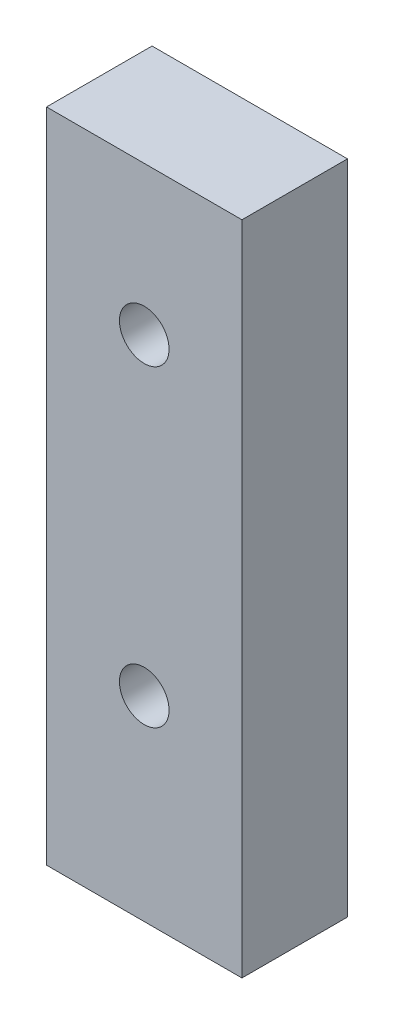
ISO-10303-21;
HEADER;
FILE_DESCRIPTION(('STEP AP214'),'2;1');
FILE_NAME('part.step','',(''),(''),'','','');
FILE_SCHEMA(('AUTOMOTIVE_DESIGN { 1 0 10303 214 1 1 1 1 }'));
ENDSEC;
DATA;
#1=APPLICATION_CONTEXT('core data for automotive mechanical design processes');
#2=APPLICATION_PROTOCOL_DEFINITION('international standard','automotive_design',2000,#1);
#3=PRODUCT_CONTEXT('',#1,'mechanical');
#4=PRODUCT('Part','Part','',(#3));
#5=PRODUCT_RELATED_PRODUCT_CATEGORY('part','',(#4));
#6=PRODUCT_DEFINITION_FORMATION('','',#4);
#7=PRODUCT_DEFINITION_CONTEXT('part definition',#1,'design');
#8=PRODUCT_DEFINITION('design','',#6,#7);
#9=PRODUCT_DEFINITION_SHAPE('','',#8);
#10=(LENGTH_UNIT() NAMED_UNIT(*) SI_UNIT(.MILLI.,.METRE.));
#11=(NAMED_UNIT(*) PLANE_ANGLE_UNIT() SI_UNIT($,.RADIAN.));
#12=(NAMED_UNIT(*) SI_UNIT($,.STERADIAN.) SOLID_ANGLE_UNIT());
#13=UNCERTAINTY_MEASURE_WITH_UNIT(LENGTH_MEASURE(1.E-05),#10,'distance_accuracy_value','');
#14=(GEOMETRIC_REPRESENTATION_CONTEXT(3) GLOBAL_UNCERTAINTY_ASSIGNED_CONTEXT((#13)) GLOBAL_UNIT_ASSIGNED_CONTEXT((#10,
#11,#12)) REPRESENTATION_CONTEXT('',''));
#15=CARTESIAN_POINT('',(0.,0.,0.));
#16=DIRECTION('',(0.,0.,1.));
#17=DIRECTION('',(1.,0.,0.));
#18=AXIS2_PLACEMENT_3D('',#15,#16,#17);
#19=CARTESIAN_POINT('',(0.,0.,13.5));
#20=DIRECTION('',(1.,0.,0.));
#21=DIRECTION('',(0.,0.,-1.));
#22=AXIS2_PLACEMENT_3D('',#19,#20,#21);
#23=PLANE('',#22);
#24=DIRECTION('',(0.,-1.,0.));
#25=VECTOR('',#24,1.);
#26=CARTESIAN_POINT('',(0.,0.,0.));
#27=LINE('',#26,#25);
#28=CARTESIAN_POINT('',(0.,84.,0.));
#29=VERTEX_POINT('',#28);
#30=CARTESIAN_POINT('',(0.,0.,0.));
#31=VERTEX_POINT('',#30);
#32=EDGE_CURVE('E99',#29,#31,#27,.T.);
#33=ORIENTED_EDGE('',*,*,#32,.T.);
#34=DIRECTION('',(0.,0.,-1.));
#35=VECTOR('',#34,1.);
#36=CARTESIAN_POINT('',(0.,0.,13.5));
#37=LINE('',#36,#35);
#38=CARTESIAN_POINT('',(0.,0.,13.5));
#39=VERTEX_POINT('',#38);
#40=EDGE_CURVE('E11',#39,#31,#37,.T.);
#41=ORIENTED_EDGE('',*,*,#40,.F.);
#42=DIRECTION('',(0.,-1.,0.));
#43=VECTOR('',#42,1.);
#44=CARTESIAN_POINT('',(0.,0.,13.5));
#45=LINE('',#44,#43);
#46=CARTESIAN_POINT('',(0.,84.,13.5));
#47=VERTEX_POINT('',#46);
#48=EDGE_CURVE('E87',#47,#39,#45,.T.);
#49=ORIENTED_EDGE('',*,*,#48,.F.);
#50=DIRECTION('',(0.,0.,-1.));
#51=VECTOR('',#50,1.);
#52=CARTESIAN_POINT('',(0.,84.,13.5));
#53=LINE('',#52,#51);
#54=EDGE_CURVE('E95',#47,#29,#53,.T.);
#55=ORIENTED_EDGE('',*,*,#54,.T.);
#56=EDGE_LOOP('',(#33,#41,#49,#55));
#57=FACE_BOUND('',#56,.T.);
#58=ADVANCED_FACE('F36',(#57),#23,.F.);
#59=CARTESIAN_POINT('',(0.,0.,13.5));
#60=DIRECTION('',(0.,1.,0.));
#61=DIRECTION('',(0.,0.,1.));
#62=AXIS2_PLACEMENT_3D('',#59,#60,#61);
#63=PLANE('',#62);
#64=DIRECTION('',(1.,0.,0.));
#65=VECTOR('',#64,1.);
#66=CARTESIAN_POINT('',(0.,0.,0.));
#67=LINE('',#66,#65);
#68=CARTESIAN_POINT('',(25.,0.,0.));
#69=VERTEX_POINT('',#68);
#70=EDGE_CURVE('E91',#31,#69,#67,.T.);
#71=ORIENTED_EDGE('',*,*,#70,.T.);
#72=DIRECTION('',(0.,0.,-1.));
#73=VECTOR('',#72,1.);
#74=CARTESIAN_POINT('',(25.,0.,13.5));
#75=LINE('',#74,#73);
#76=CARTESIAN_POINT('',(25.,0.,13.5));
#77=VERTEX_POINT('',#76);
#78=EDGE_CURVE('E44',#77,#69,#75,.T.);
#79=ORIENTED_EDGE('',*,*,#78,.F.);
#80=DIRECTION('',(1.,0.,0.));
#81=VECTOR('',#80,1.);
#82=CARTESIAN_POINT('',(0.,0.,13.5));
#83=LINE('',#82,#81);
#84=EDGE_CURVE('E82',#39,#77,#83,.T.);
#85=ORIENTED_EDGE('',*,*,#84,.F.);
#86=ORIENTED_EDGE('',*,*,#40,.T.);
#87=EDGE_LOOP('',(#71,#79,#85,#86));
#88=FACE_BOUND('',#87,.T.);
#89=ADVANCED_FACE('F90',(#88),#63,.F.);
#90=CARTESIAN_POINT('',(25.,0.,13.5));
#91=DIRECTION('',(-1.,0.,0.));
#92=DIRECTION('',(0.,0.,1.));
#93=AXIS2_PLACEMENT_3D('',#90,#91,#92);
#94=PLANE('',#93);
#95=DIRECTION('',(0.,1.,0.));
#96=VECTOR('',#95,1.);
#97=CARTESIAN_POINT('',(25.,0.,0.));
#98=LINE('',#97,#96);
#99=CARTESIAN_POINT('',(25.,84.,0.));
#100=VERTEX_POINT('',#99);
#101=EDGE_CURVE('E69',#69,#100,#98,.T.);
#102=ORIENTED_EDGE('',*,*,#101,.T.);
#103=DIRECTION('',(0.,0.,-1.));
#104=VECTOR('',#103,1.);
#105=CARTESIAN_POINT('',(25.,84.,13.5));
#106=LINE('',#105,#104);
#107=CARTESIAN_POINT('',(25.,84.,13.5));
#108=VERTEX_POINT('',#107);
#109=EDGE_CURVE('E92',#108,#100,#106,.T.);
#110=ORIENTED_EDGE('',*,*,#109,.F.);
#111=DIRECTION('',(0.,1.,0.));
#112=VECTOR('',#111,1.);
#113=CARTESIAN_POINT('',(25.,0.,13.5));
#114=LINE('',#113,#112);
#115=EDGE_CURVE('E85',#77,#108,#114,.T.);
#116=ORIENTED_EDGE('',*,*,#115,.F.);
#117=ORIENTED_EDGE('',*,*,#78,.T.);
#118=EDGE_LOOP('',(#102,#110,#116,#117));
#119=FACE_BOUND('',#118,.T.);
#120=ADVANCED_FACE('F93',(#119),#94,.F.);
#121=CARTESIAN_POINT('',(0.,84.,13.5));
#122=DIRECTION('',(0.,-1.,0.));
#123=DIRECTION('',(0.,0.,-1.));
#124=AXIS2_PLACEMENT_3D('',#121,#122,#123);
#125=PLANE('',#124);
#126=DIRECTION('',(-1.,0.,0.));
#127=VECTOR('',#126,1.);
#128=CARTESIAN_POINT('',(0.,84.,0.));
#129=LINE('',#128,#127);
#130=EDGE_CURVE('E75',#100,#29,#129,.T.);
#131=ORIENTED_EDGE('',*,*,#130,.T.);
#132=ORIENTED_EDGE('',*,*,#54,.F.);
#133=DIRECTION('',(-1.,0.,0.));
#134=VECTOR('',#133,1.);
#135=CARTESIAN_POINT('',(0.,84.,13.5));
#136=LINE('',#135,#134);
#137=EDGE_CURVE('E52',#108,#47,#136,.T.);
#138=ORIENTED_EDGE('',*,*,#137,.F.);
#139=ORIENTED_EDGE('',*,*,#109,.T.);
#140=EDGE_LOOP('',(#131,#132,#138,#139));
#141=FACE_BOUND('',#140,.T.);
#142=ADVANCED_FACE('F107',(#141),#125,.F.);
#143=CARTESIAN_POINT('',(0.,0.,13.5));
#144=DIRECTION('',(0.,0.,-1.));
#145=DIRECTION('',(-1.,0.,0.));
#146=AXIS2_PLACEMENT_3D('',#143,#144,#145);
#147=PLANE('',#146);
#148=CARTESIAN_POINT('',(12.5,65.,13.5));
#149=DIRECTION('',(0.,0.,1.));
#150=DIRECTION('',(1.,0.,0.));
#151=AXIS2_PLACEMENT_3D('',#148,#149,#150);
#152=CIRCLE('',#151,3.175);
#153=CARTESIAN_POINT('',(15.675,65.,13.5));
#154=VERTEX_POINT('',#153);
#155=EDGE_CURVE('E116',#154,#154,#152,.T.);
#156=ORIENTED_EDGE('',*,*,#155,.F.);
#157=EDGE_LOOP('',(#156));
#158=FACE_BOUND('',#157,.T.);
#159=CARTESIAN_POINT('',(12.5,25.,13.5));
#160=DIRECTION('',(0.,0.,1.));
#161=DIRECTION('',(1.,0.,0.));
#162=AXIS2_PLACEMENT_3D('',#159,#160,#161);
#163=CIRCLE('',#162,3.175);
#164=CARTESIAN_POINT('',(15.675,25.,13.5));
#165=VERTEX_POINT('',#164);
#166=EDGE_CURVE('E113',#165,#165,#163,.T.);
#167=ORIENTED_EDGE('',*,*,#166,.F.);
#168=EDGE_LOOP('',(#167));
#169=FACE_BOUND('',#168,.T.);
#170=ORIENTED_EDGE('',*,*,#48,.T.);
#171=ORIENTED_EDGE('',*,*,#84,.T.);
#172=ORIENTED_EDGE('',*,*,#115,.T.);
#173=ORIENTED_EDGE('',*,*,#137,.T.);
#174=EDGE_LOOP('',(#170,#171,#172,#173));
#175=FACE_BOUND('',#174,.T.);
#176=ADVANCED_FACE('F83',(#158,#169,#175),#147,.F.);
#177=CARTESIAN_POINT('',(0.,0.,0.));
#178=DIRECTION('',(0.,0.,-1.));
#179=DIRECTION('',(-1.,0.,0.));
#180=AXIS2_PLACEMENT_3D('',#177,#178,#179);
#181=PLANE('',#180);
#182=CARTESIAN_POINT('',(12.5,65.,0.));
#183=DIRECTION('',(0.,0.,-1.));
#184=DIRECTION('',(-1.,0.,0.));
#185=AXIS2_PLACEMENT_3D('',#182,#183,#184);
#186=CIRCLE('',#185,3.175);
#187=CARTESIAN_POINT('',(9.325,65.,0.));
#188=VERTEX_POINT('',#187);
#189=EDGE_CURVE('E102',#188,#188,#186,.F.);
#190=ORIENTED_EDGE('',*,*,#189,.T.);
#191=EDGE_LOOP('',(#190));
#192=FACE_BOUND('',#191,.T.);
#193=CARTESIAN_POINT('',(12.5,25.,0.));
#194=DIRECTION('',(0.,0.,-1.));
#195=DIRECTION('',(-1.,0.,0.));
#196=AXIS2_PLACEMENT_3D('',#193,#194,#195);
#197=CIRCLE('',#196,3.175);
#198=CARTESIAN_POINT('',(9.325,25.,0.));
#199=VERTEX_POINT('',#198);
#200=EDGE_CURVE('E117',#199,#199,#197,.F.);
#201=ORIENTED_EDGE('',*,*,#200,.T.);
#202=EDGE_LOOP('',(#201));
#203=FACE_BOUND('',#202,.T.);
#204=ORIENTED_EDGE('',*,*,#32,.F.);
#205=ORIENTED_EDGE('',*,*,#130,.F.);
#206=ORIENTED_EDGE('',*,*,#101,.F.);
#207=ORIENTED_EDGE('',*,*,#70,.F.);
#208=EDGE_LOOP('',(#204,#205,#206,#207));
#209=FACE_BOUND('',#208,.T.);
#210=ADVANCED_FACE('F110',(#192,#203,#209),#181,.T.);
#211=CARTESIAN_POINT('',(12.5,25.,-8.98025612106916));
#212=DIRECTION('',(0.,0.,1.));
#213=DIRECTION('',(1.,0.,0.));
#214=AXIS2_PLACEMENT_3D('',#211,#212,#213);
#215=CYLINDRICAL_SURFACE('',#214,3.175);
#216=ORIENTED_EDGE('',*,*,#166,.T.);
#217=EDGE_LOOP('',(#216));
#218=FACE_BOUND('',#217,.T.);
#219=ORIENTED_EDGE('',*,*,#200,.F.);
#220=EDGE_LOOP('',(#219));
#221=FACE_BOUND('',#220,.T.);
#222=ADVANCED_FACE('F133',(#218,#221),#215,.F.);
#223=CARTESIAN_POINT('',(12.5,65.,-8.98025612106916));
#224=DIRECTION('',(0.,0.,1.));
#225=DIRECTION('',(1.,0.,0.));
#226=AXIS2_PLACEMENT_3D('',#223,#224,#225);
#227=CYLINDRICAL_SURFACE('',#226,3.175);
#228=ORIENTED_EDGE('',*,*,#155,.T.);
#229=EDGE_LOOP('',(#228));
#230=FACE_BOUND('',#229,.T.);
#231=ORIENTED_EDGE('',*,*,#189,.F.);
#232=EDGE_LOOP('',(#231));
#233=FACE_BOUND('',#232,.T.);
#234=ADVANCED_FACE('F125',(#230,#233),#227,.F.);
#235=CLOSED_SHELL('',(#58,#89,#120,#142,#176,#210,#222,#234));
#236=MANIFOLD_SOLID_BREP('B2',#235);
#237=ADVANCED_BREP_SHAPE_REPRESENTATION('',(#18,#236),#14);
#238=SHAPE_DEFINITION_REPRESENTATION(#9,#237);
ENDSEC;
END-ISO-10303-21;
